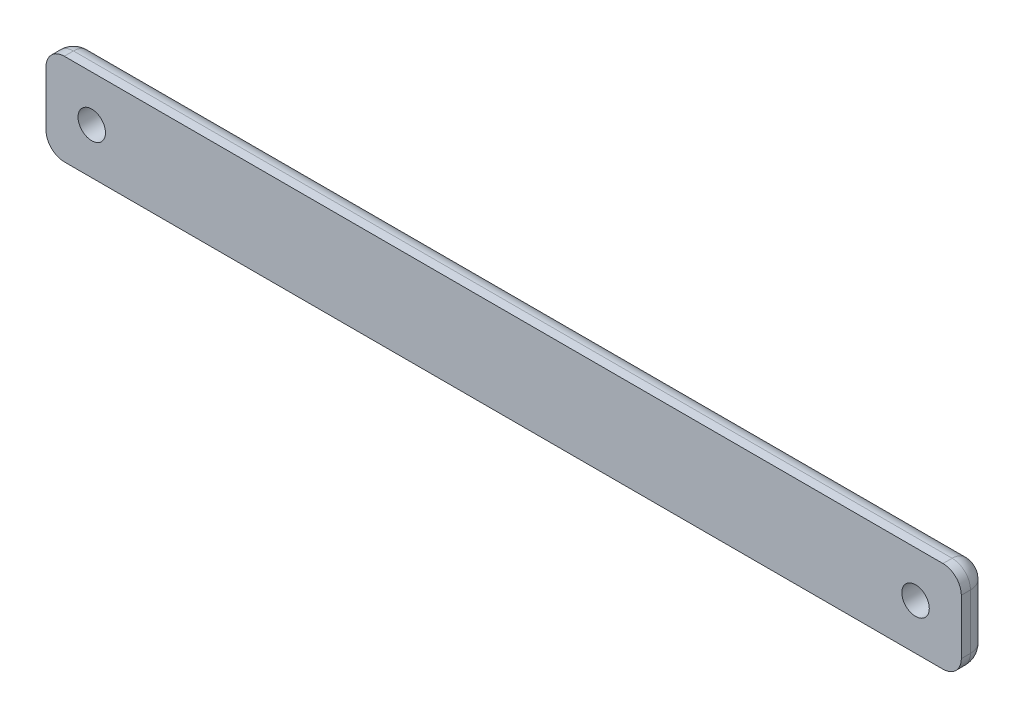
ISO-10303-21;
HEADER;
FILE_DESCRIPTION(('STEP AP214'),'2;1');
FILE_NAME('part.step','',(''),(''),'','','');
FILE_SCHEMA(('AUTOMOTIVE_DESIGN { 1 0 10303 214 1 1 1 1 }'));
ENDSEC;
DATA;
#1=APPLICATION_CONTEXT('core data for automotive mechanical design processes');
#2=APPLICATION_PROTOCOL_DEFINITION('international standard','automotive_design',2000,#1);
#3=PRODUCT_CONTEXT('',#1,'mechanical');
#4=PRODUCT('Part','Part','',(#3));
#5=PRODUCT_RELATED_PRODUCT_CATEGORY('part','',(#4));
#6=PRODUCT_DEFINITION_FORMATION('','',#4);
#7=PRODUCT_DEFINITION_CONTEXT('part definition',#1,'design');
#8=PRODUCT_DEFINITION('design','',#6,#7);
#9=PRODUCT_DEFINITION_SHAPE('','',#8);
#10=(LENGTH_UNIT() NAMED_UNIT(*) SI_UNIT(.MILLI.,.METRE.));
#11=(NAMED_UNIT(*) PLANE_ANGLE_UNIT() SI_UNIT($,.RADIAN.));
#12=(NAMED_UNIT(*) SI_UNIT($,.STERADIAN.) SOLID_ANGLE_UNIT());
#13=UNCERTAINTY_MEASURE_WITH_UNIT(LENGTH_MEASURE(1.E-05),#10,'distance_accuracy_value','');
#14=(GEOMETRIC_REPRESENTATION_CONTEXT(3) GLOBAL_UNCERTAINTY_ASSIGNED_CONTEXT((#13)) GLOBAL_UNIT_ASSIGNED_CONTEXT((#10,
#11,#12)) REPRESENTATION_CONTEXT('',''));
#15=CARTESIAN_POINT('',(0.,0.,0.));
#16=DIRECTION('',(0.,0.,1.));
#17=DIRECTION('',(1.,0.,0.));
#18=AXIS2_PLACEMENT_3D('',#15,#16,#17);
#19=CARTESIAN_POINT('',(50.,5.,1.5));
#20=DIRECTION('',(-1.,0.,0.));
#21=DIRECTION('',(0.,0.,1.));
#22=AXIS2_PLACEMENT_3D('',#19,#20,#21);
#23=PLANE('',#22);
#24=DIRECTION('',(0.,1.,0.));
#25=VECTOR('',#24,1.);
#26=CARTESIAN_POINT('',(50.,5.,1.5));
#27=LINE('',#26,#25);
#28=CARTESIAN_POINT('',(50.,-3.,1.5));
#29=VERTEX_POINT('',#28);
#30=CARTESIAN_POINT('',(50.,3.,1.5));
#31=VERTEX_POINT('',#30);
#32=EDGE_CURVE('E130',#29,#31,#27,.T.);
#33=ORIENTED_EDGE('',*,*,#32,.F.);
#34=DIRECTION('',(0.,0.,-1.));
#35=VECTOR('',#34,1.);
#36=CARTESIAN_POINT('',(50.,-3.,1.5));
#37=LINE('',#36,#35);
#38=CARTESIAN_POINT('',(50.,-3.,0.5));
#39=VERTEX_POINT('',#38);
#40=EDGE_CURVE('E143',#29,#39,#37,.T.);
#41=ORIENTED_EDGE('',*,*,#40,.T.);
#42=DIRECTION('',(0.,1.,0.));
#43=VECTOR('',#42,1.);
#44=CARTESIAN_POINT('',(50.,5.,0.5));
#45=LINE('',#44,#43);
#46=CARTESIAN_POINT('',(50.,3.,0.5));
#47=VERTEX_POINT('',#46);
#48=EDGE_CURVE('E159',#39,#47,#45,.T.);
#49=ORIENTED_EDGE('',*,*,#48,.T.);
#50=DIRECTION('',(0.,0.,-1.));
#51=VECTOR('',#50,1.);
#52=CARTESIAN_POINT('',(50.,3.,1.5));
#53=LINE('',#52,#51);
#54=EDGE_CURVE('E145',#47,#31,#53,.F.);
#55=ORIENTED_EDGE('',*,*,#54,.T.);
#56=EDGE_LOOP('',(#33,#41,#49,#55));
#57=FACE_BOUND('',#56,.T.);
#58=ADVANCED_FACE('F45',(#57),#23,.F.);
#59=CARTESIAN_POINT('',(-50.,5.,1.5));
#60=DIRECTION('',(0.,-1.,0.));
#61=DIRECTION('',(0.,0.,-1.));
#62=AXIS2_PLACEMENT_3D('',#59,#60,#61);
#63=PLANE('',#62);
#64=DIRECTION('',(-1.,0.,0.));
#65=VECTOR('',#64,1.);
#66=CARTESIAN_POINT('',(-50.,5.,0.5));
#67=LINE('',#66,#65);
#68=CARTESIAN_POINT('',(48.,5.,0.5));
#69=VERTEX_POINT('',#68);
#70=CARTESIAN_POINT('',(-48.,5.,0.5));
#71=VERTEX_POINT('',#70);
#72=EDGE_CURVE('E184',#69,#71,#67,.T.);
#73=ORIENTED_EDGE('',*,*,#72,.T.);
#74=DIRECTION('',(0.,0.,-1.));
#75=VECTOR('',#74,1.);
#76=CARTESIAN_POINT('',(-48.,5.,1.5));
#77=LINE('',#76,#75);
#78=CARTESIAN_POINT('',(-48.,5.,1.5));
#79=VERTEX_POINT('',#78);
#80=EDGE_CURVE('E190',#71,#79,#77,.F.);
#81=ORIENTED_EDGE('',*,*,#80,.T.);
#82=DIRECTION('',(-1.,0.,0.));
#83=VECTOR('',#82,1.);
#84=CARTESIAN_POINT('',(-50.,5.,1.5));
#85=LINE('',#84,#83);
#86=CARTESIAN_POINT('',(48.,5.,1.5));
#87=VERTEX_POINT('',#86);
#88=EDGE_CURVE('E147',#87,#79,#85,.T.);
#89=ORIENTED_EDGE('',*,*,#88,.F.);
#90=DIRECTION('',(0.,0.,-1.));
#91=VECTOR('',#90,1.);
#92=CARTESIAN_POINT('',(48.,5.,1.5));
#93=LINE('',#92,#91);
#94=EDGE_CURVE('E187',#87,#69,#93,.T.);
#95=ORIENTED_EDGE('',*,*,#94,.T.);
#96=EDGE_LOOP('',(#73,#81,#89,#95));
#97=FACE_BOUND('',#96,.T.);
#98=ADVANCED_FACE('F291',(#97),#63,.F.);
#99=CARTESIAN_POINT('',(-50.,5.,1.5));
#100=DIRECTION('',(1.,0.,0.));
#101=DIRECTION('',(0.,0.,-1.));
#102=AXIS2_PLACEMENT_3D('',#99,#100,#101);
#103=PLANE('',#102);
#104=DIRECTION('',(0.,-1.,0.));
#105=VECTOR('',#104,1.);
#106=CARTESIAN_POINT('',(-50.,5.,0.5));
#107=LINE('',#106,#105);
#108=CARTESIAN_POINT('',(-50.,3.,0.5));
#109=VERTEX_POINT('',#108);
#110=CARTESIAN_POINT('',(-50.,-3.,0.5));
#111=VERTEX_POINT('',#110);
#112=EDGE_CURVE('E138',#109,#111,#107,.T.);
#113=ORIENTED_EDGE('',*,*,#112,.T.);
#114=DIRECTION('',(0.,0.,-1.));
#115=VECTOR('',#114,1.);
#116=CARTESIAN_POINT('',(-50.,-3.,1.5));
#117=LINE('',#116,#115);
#118=CARTESIAN_POINT('',(-50.,-3.,1.5));
#119=VERTEX_POINT('',#118);
#120=EDGE_CURVE('E181',#111,#119,#117,.F.);
#121=ORIENTED_EDGE('',*,*,#120,.T.);
#122=DIRECTION('',(0.,-1.,0.));
#123=VECTOR('',#122,1.);
#124=CARTESIAN_POINT('',(-50.,5.,1.5));
#125=LINE('',#124,#123);
#126=CARTESIAN_POINT('',(-50.,3.,1.5));
#127=VERTEX_POINT('',#126);
#128=EDGE_CURVE('E262',#127,#119,#125,.T.);
#129=ORIENTED_EDGE('',*,*,#128,.F.);
#130=DIRECTION('',(0.,0.,-1.));
#131=VECTOR('',#130,1.);
#132=CARTESIAN_POINT('',(-50.,3.,1.5));
#133=LINE('',#132,#131);
#134=EDGE_CURVE('E178',#127,#109,#133,.T.);
#135=ORIENTED_EDGE('',*,*,#134,.T.);
#136=EDGE_LOOP('',(#113,#121,#129,#135));
#137=FACE_BOUND('',#136,.T.);
#138=ADVANCED_FACE('F299',(#137),#103,.F.);
#139=CARTESIAN_POINT('',(-50.,-5.,1.5));
#140=DIRECTION('',(0.,1.,0.));
#141=DIRECTION('',(0.,0.,1.));
#142=AXIS2_PLACEMENT_3D('',#139,#140,#141);
#143=PLANE('',#142);
#144=DIRECTION('',(1.,0.,0.));
#145=VECTOR('',#144,1.);
#146=CARTESIAN_POINT('',(-50.,-5.,0.5));
#147=LINE('',#146,#145);
#148=CARTESIAN_POINT('',(-48.,-5.,0.5));
#149=VERTEX_POINT('',#148);
#150=CARTESIAN_POINT('',(48.,-5.,0.5));
#151=VERTEX_POINT('',#150);
#152=EDGE_CURVE('E153',#149,#151,#147,.T.);
#153=ORIENTED_EDGE('',*,*,#152,.T.);
#154=DIRECTION('',(0.,0.,-1.));
#155=VECTOR('',#154,1.);
#156=CARTESIAN_POINT('',(48.,-5.,1.5));
#157=LINE('',#156,#155);
#158=CARTESIAN_POINT('',(48.,-5.,1.5));
#159=VERTEX_POINT('',#158);
#160=EDGE_CURVE('E165',#151,#159,#157,.F.);
#161=ORIENTED_EDGE('',*,*,#160,.T.);
#162=DIRECTION('',(1.,0.,0.));
#163=VECTOR('',#162,1.);
#164=CARTESIAN_POINT('',(-50.,-5.,1.5));
#165=LINE('',#164,#163);
#166=CARTESIAN_POINT('',(-48.,-5.,1.5));
#167=VERTEX_POINT('',#166);
#168=EDGE_CURVE('E133',#167,#159,#165,.T.);
#169=ORIENTED_EDGE('',*,*,#168,.F.);
#170=DIRECTION('',(0.,0.,-1.));
#171=VECTOR('',#170,1.);
#172=CARTESIAN_POINT('',(-48.,-5.,1.5));
#173=LINE('',#172,#171);
#174=EDGE_CURVE('E157',#167,#149,#173,.T.);
#175=ORIENTED_EDGE('',*,*,#174,.T.);
#176=EDGE_LOOP('',(#153,#161,#169,#175));
#177=FACE_BOUND('',#176,.T.);
#178=ADVANCED_FACE('F316',(#177),#143,.F.);
#179=CARTESIAN_POINT('',(0.,0.,1.5));
#180=DIRECTION('',(0.,0.,1.));
#181=DIRECTION('',(1.,0.,0.));
#182=AXIS2_PLACEMENT_3D('',#179,#180,#181);
#183=PLANE('',#182);
#184=CARTESIAN_POINT('',(-45.,0.,1.5));
#185=DIRECTION('',(0.,0.,1.));
#186=DIRECTION('',(1.,0.,0.));
#187=AXIS2_PLACEMENT_3D('',#184,#185,#186);
#188=CIRCLE('',#187,1.5);
#189=CARTESIAN_POINT('',(-43.5,0.,1.5));
#190=VERTEX_POINT('',#189);
#191=EDGE_CURVE('E250',#190,#190,#188,.T.);
#192=ORIENTED_EDGE('',*,*,#191,.F.);
#193=EDGE_LOOP('',(#192));
#194=FACE_BOUND('',#193,.T.);
#195=CARTESIAN_POINT('',(45.,0.,1.5));
#196=DIRECTION('',(0.,0.,1.));
#197=DIRECTION('',(1.,0.,0.));
#198=AXIS2_PLACEMENT_3D('',#195,#196,#197);
#199=CIRCLE('',#198,1.5);
#200=CARTESIAN_POINT('',(46.5,0.,1.5));
#201=VERTEX_POINT('',#200);
#202=EDGE_CURVE('E244',#201,#201,#199,.T.);
#203=ORIENTED_EDGE('',*,*,#202,.F.);
#204=EDGE_LOOP('',(#203));
#205=FACE_BOUND('',#204,.T.);
#206=ORIENTED_EDGE('',*,*,#168,.T.);
#207=CARTESIAN_POINT('',(48.,-3.,1.5));
#208=DIRECTION('',(0.,0.,1.));
#209=DIRECTION('',(1.,0.,0.));
#210=AXIS2_PLACEMENT_3D('',#207,#208,#209);
#211=CIRCLE('',#210,2.);
#212=EDGE_CURVE('E127',#159,#29,#211,.T.);
#213=ORIENTED_EDGE('',*,*,#212,.T.);
#214=ORIENTED_EDGE('',*,*,#32,.T.);
#215=CARTESIAN_POINT('',(48.,3.,1.5));
#216=DIRECTION('',(0.,0.,1.));
#217=DIRECTION('',(1.,0.,0.));
#218=AXIS2_PLACEMENT_3D('',#215,#216,#217);
#219=CIRCLE('',#218,2.);
#220=EDGE_CURVE('E168',#31,#87,#219,.T.);
#221=ORIENTED_EDGE('',*,*,#220,.T.);
#222=ORIENTED_EDGE('',*,*,#88,.T.);
#223=CARTESIAN_POINT('',(-48.,3.,1.5));
#224=DIRECTION('',(0.,0.,1.));
#225=DIRECTION('',(1.,0.,0.));
#226=AXIS2_PLACEMENT_3D('',#223,#224,#225);
#227=CIRCLE('',#226,2.);
#228=EDGE_CURVE('E171',#79,#127,#227,.T.);
#229=ORIENTED_EDGE('',*,*,#228,.T.);
#230=ORIENTED_EDGE('',*,*,#128,.T.);
#231=CARTESIAN_POINT('',(-48.,-3.,1.5));
#232=DIRECTION('',(0.,0.,1.));
#233=DIRECTION('',(1.,0.,0.));
#234=AXIS2_PLACEMENT_3D('',#231,#232,#233);
#235=CIRCLE('',#234,2.);
#236=EDGE_CURVE('E139',#119,#167,#235,.T.);
#237=ORIENTED_EDGE('',*,*,#236,.T.);
#238=EDGE_LOOP('',(#206,#213,#214,#221,#222,#229,#230,#237));
#239=FACE_BOUND('',#238,.T.);
#240=ADVANCED_FACE('F129',(#194,#205,#239),#183,.T.);
#241=CARTESIAN_POINT('',(0.,0.,-1.5));
#242=DIRECTION('',(0.,0.,1.));
#243=DIRECTION('',(1.,0.,0.));
#244=AXIS2_PLACEMENT_3D('',#241,#242,#243);
#245=PLANE('',#244);
#246=DIRECTION('',(-1.,0.,0.));
#247=VECTOR('',#246,1.);
#248=CARTESIAN_POINT('',(0.,3.,-1.5));
#249=LINE('',#248,#247);
#250=CARTESIAN_POINT('',(-48.,3.,-1.5));
#251=VERTEX_POINT('',#250);
#252=CARTESIAN_POINT('',(48.,3.,-1.5));
#253=VERTEX_POINT('',#252);
#254=EDGE_CURVE('E193',#251,#253,#249,.F.);
#255=ORIENTED_EDGE('',*,*,#254,.T.);
#256=DIRECTION('',(0.,1.,0.));
#257=VECTOR('',#256,1.);
#258=CARTESIAN_POINT('',(48.,0.,-1.5));
#259=LINE('',#258,#257);
#260=CARTESIAN_POINT('',(48.,-3.,-1.5));
#261=VERTEX_POINT('',#260);
#262=EDGE_CURVE('E11',#253,#261,#259,.F.);
#263=ORIENTED_EDGE('',*,*,#262,.T.);
#264=DIRECTION('',(1.,0.,0.));
#265=VECTOR('',#264,1.);
#266=CARTESIAN_POINT('',(0.,-3.,-1.5));
#267=LINE('',#266,#265);
#268=CARTESIAN_POINT('',(-48.,-3.,-1.5));
#269=VERTEX_POINT('',#268);
#270=EDGE_CURVE('E55',#261,#269,#267,.F.);
#271=ORIENTED_EDGE('',*,*,#270,.T.);
#272=DIRECTION('',(0.,-1.,0.));
#273=VECTOR('',#272,1.);
#274=CARTESIAN_POINT('',(-48.,0.,-1.5));
#275=LINE('',#274,#273);
#276=EDGE_CURVE('E196',#269,#251,#275,.F.);
#277=ORIENTED_EDGE('',*,*,#276,.T.);
#278=EDGE_LOOP('',(#255,#263,#271,#277));
#279=FACE_BOUND('',#278,.T.);
#280=CARTESIAN_POINT('',(-45.,0.,-1.5));
#281=DIRECTION('',(0.,0.,1.));
#282=DIRECTION('',(1.,0.,0.));
#283=AXIS2_PLACEMENT_3D('',#280,#281,#282);
#284=CIRCLE('',#283,1.5);
#285=CARTESIAN_POINT('',(-43.5,0.,-1.5));
#286=VERTEX_POINT('',#285);
#287=EDGE_CURVE('E148',#286,#286,#284,.T.);
#288=ORIENTED_EDGE('',*,*,#287,.T.);
#289=EDGE_LOOP('',(#288));
#290=FACE_BOUND('',#289,.T.);
#291=CARTESIAN_POINT('',(45.,0.,-1.5));
#292=DIRECTION('',(0.,0.,1.));
#293=DIRECTION('',(1.,0.,0.));
#294=AXIS2_PLACEMENT_3D('',#291,#292,#293);
#295=CIRCLE('',#294,1.5);
#296=CARTESIAN_POINT('',(46.5,0.,-1.5));
#297=VERTEX_POINT('',#296);
#298=EDGE_CURVE('E256',#297,#297,#295,.T.);
#299=ORIENTED_EDGE('',*,*,#298,.T.);
#300=EDGE_LOOP('',(#299));
#301=FACE_BOUND('',#300,.T.);
#302=ADVANCED_FACE('F286',(#279,#290,#301),#245,.F.);
#303=CARTESIAN_POINT('',(45.,0.,-8.5));
#304=DIRECTION('',(0.,0.,1.));
#305=DIRECTION('',(1.,0.,0.));
#306=AXIS2_PLACEMENT_3D('',#303,#304,#305);
#307=CYLINDRICAL_SURFACE('',#306,1.5);
#308=ORIENTED_EDGE('',*,*,#202,.T.);
#309=EDGE_LOOP('',(#308));
#310=FACE_BOUND('',#309,.T.);
#311=ORIENTED_EDGE('',*,*,#298,.F.);
#312=EDGE_LOOP('',(#311));
#313=FACE_BOUND('',#312,.T.);
#314=ADVANCED_FACE('F340',(#310,#313),#307,.F.);
#315=CARTESIAN_POINT('',(-45.,0.,-8.5));
#316=DIRECTION('',(0.,0.,1.));
#317=DIRECTION('',(1.,0.,0.));
#318=AXIS2_PLACEMENT_3D('',#315,#316,#317);
#319=CYLINDRICAL_SURFACE('',#318,1.5);
#320=ORIENTED_EDGE('',*,*,#191,.T.);
#321=EDGE_LOOP('',(#320));
#322=FACE_BOUND('',#321,.T.);
#323=ORIENTED_EDGE('',*,*,#287,.F.);
#324=EDGE_LOOP('',(#323));
#325=FACE_BOUND('',#324,.T.);
#326=ADVANCED_FACE('F346',(#322,#325),#319,.F.);
#327=CARTESIAN_POINT('',(-48.,3.,1.5));
#328=DIRECTION('',(0.,0.,-1.));
#329=DIRECTION('',(-1.,0.,0.));
#330=AXIS2_PLACEMENT_3D('',#327,#328,#329);
#331=CYLINDRICAL_SURFACE('',#330,2.);
#332=CARTESIAN_POINT('',(-48.,3.,0.5));
#333=DIRECTION('',(0.,0.,-1.));
#334=DIRECTION('',(-1.,0.,0.));
#335=AXIS2_PLACEMENT_3D('',#332,#333,#334);
#336=CIRCLE('',#335,2.);
#337=EDGE_CURVE('E49',#109,#71,#336,.T.);
#338=ORIENTED_EDGE('',*,*,#337,.F.);
#339=ORIENTED_EDGE('',*,*,#134,.F.);
#340=ORIENTED_EDGE('',*,*,#228,.F.);
#341=ORIENTED_EDGE('',*,*,#80,.F.);
#342=EDGE_LOOP('',(#338,#339,#340,#341));
#343=FACE_BOUND('',#342,.T.);
#344=ADVANCED_FACE('F47',(#343),#331,.T.);
#345=CARTESIAN_POINT('',(-48.,3.,0.5));
#346=DIRECTION('',(0.,1.,0.));
#347=DIRECTION('',(0.,0.,1.));
#348=AXIS2_PLACEMENT_3D('',#345,#346,#347);
#349=SPHERICAL_SURFACE('',#348,2.);
#350=CARTESIAN_POINT('',(-48.,3.,0.5));
#351=DIRECTION('',(0.,1.,0.));
#352=DIRECTION('',(0.,0.,1.));
#353=AXIS2_PLACEMENT_3D('',#350,#351,#352);
#354=CIRCLE('',#353,2.);
#355=EDGE_CURVE('E232',#109,#251,#354,.F.);
#356=ORIENTED_EDGE('',*,*,#355,.F.);
#357=ORIENTED_EDGE('',*,*,#337,.T.);
#358=CARTESIAN_POINT('',(-48.,3.,0.5));
#359=DIRECTION('',(-1.,0.,0.));
#360=DIRECTION('',(0.,0.,1.));
#361=AXIS2_PLACEMENT_3D('',#358,#359,#360);
#362=CIRCLE('',#361,2.);
#363=EDGE_CURVE('E235',#251,#71,#362,.F.);
#364=ORIENTED_EDGE('',*,*,#363,.F.);
#365=EDGE_LOOP('',(#356,#357,#364));
#366=FACE_BOUND('',#365,.T.);
#367=ADVANCED_FACE('F351',(#366),#349,.T.);
#368=CARTESIAN_POINT('',(48.,3.,1.5));
#369=DIRECTION('',(0.,0.,-1.));
#370=DIRECTION('',(-1.,0.,0.));
#371=AXIS2_PLACEMENT_3D('',#368,#369,#370);
#372=CYLINDRICAL_SURFACE('',#371,2.);
#373=ORIENTED_EDGE('',*,*,#220,.F.);
#374=ORIENTED_EDGE('',*,*,#54,.F.);
#375=CARTESIAN_POINT('',(48.,3.,0.5));
#376=DIRECTION('',(0.,0.,-1.));
#377=DIRECTION('',(-1.,0.,0.));
#378=AXIS2_PLACEMENT_3D('',#375,#376,#377);
#379=CIRCLE('',#378,2.);
#380=EDGE_CURVE('E228',#69,#47,#379,.T.);
#381=ORIENTED_EDGE('',*,*,#380,.F.);
#382=ORIENTED_EDGE('',*,*,#94,.F.);
#383=EDGE_LOOP('',(#373,#374,#381,#382));
#384=FACE_BOUND('',#383,.T.);
#385=ADVANCED_FACE('F278',(#384),#372,.T.);
#386=CARTESIAN_POINT('',(-50.,3.,0.5));
#387=DIRECTION('',(-1.,0.,0.));
#388=DIRECTION('',(0.,0.,1.));
#389=AXIS2_PLACEMENT_3D('',#386,#387,#388);
#390=CYLINDRICAL_SURFACE('',#389,2.);
#391=ORIENTED_EDGE('',*,*,#363,.T.);
#392=ORIENTED_EDGE('',*,*,#72,.F.);
#393=CARTESIAN_POINT('',(48.,3.,0.5));
#394=DIRECTION('',(1.,0.,0.));
#395=DIRECTION('',(0.,0.,-1.));
#396=AXIS2_PLACEMENT_3D('',#393,#394,#395);
#397=CIRCLE('',#396,2.);
#398=EDGE_CURVE('E224',#253,#69,#397,.T.);
#399=ORIENTED_EDGE('',*,*,#398,.F.);
#400=ORIENTED_EDGE('',*,*,#254,.F.);
#401=EDGE_LOOP('',(#391,#392,#399,#400));
#402=FACE_BOUND('',#401,.T.);
#403=ADVANCED_FACE('F288',(#402),#390,.T.);
#404=CARTESIAN_POINT('',(-48.,5.,0.5));
#405=DIRECTION('',(0.,-1.,0.));
#406=DIRECTION('',(0.,0.,-1.));
#407=AXIS2_PLACEMENT_3D('',#404,#405,#406);
#408=CYLINDRICAL_SURFACE('',#407,2.);
#409=ORIENTED_EDGE('',*,*,#355,.T.);
#410=ORIENTED_EDGE('',*,*,#276,.F.);
#411=CARTESIAN_POINT('',(-48.,-3.,0.5));
#412=DIRECTION('',(0.,-1.,0.));
#413=DIRECTION('',(0.,0.,-1.));
#414=AXIS2_PLACEMENT_3D('',#411,#412,#413);
#415=CIRCLE('',#414,2.);
#416=EDGE_CURVE('E220',#111,#269,#415,.T.);
#417=ORIENTED_EDGE('',*,*,#416,.F.);
#418=ORIENTED_EDGE('',*,*,#112,.F.);
#419=EDGE_LOOP('',(#409,#410,#417,#418));
#420=FACE_BOUND('',#419,.T.);
#421=ADVANCED_FACE('F309',(#420),#408,.T.);
#422=CARTESIAN_POINT('',(-48.,-3.,1.5));
#423=DIRECTION('',(0.,0.,-1.));
#424=DIRECTION('',(-1.,0.,0.));
#425=AXIS2_PLACEMENT_3D('',#422,#423,#424);
#426=CYLINDRICAL_SURFACE('',#425,2.);
#427=ORIENTED_EDGE('',*,*,#236,.F.);
#428=ORIENTED_EDGE('',*,*,#120,.F.);
#429=CARTESIAN_POINT('',(-48.,-3.,0.5));
#430=DIRECTION('',(0.,0.,-1.));
#431=DIRECTION('',(-1.,0.,0.));
#432=AXIS2_PLACEMENT_3D('',#429,#430,#431);
#433=CIRCLE('',#432,2.);
#434=EDGE_CURVE('E216',#149,#111,#433,.T.);
#435=ORIENTED_EDGE('',*,*,#434,.F.);
#436=ORIENTED_EDGE('',*,*,#174,.F.);
#437=EDGE_LOOP('',(#427,#428,#435,#436));
#438=FACE_BOUND('',#437,.T.);
#439=ADVANCED_FACE('F305',(#438),#426,.T.);
#440=CARTESIAN_POINT('',(48.,3.,0.5));
#441=DIRECTION('',(0.,1.,0.));
#442=DIRECTION('',(0.,0.,1.));
#443=AXIS2_PLACEMENT_3D('',#440,#441,#442);
#444=SPHERICAL_SURFACE('',#443,2.);
#445=ORIENTED_EDGE('',*,*,#398,.T.);
#446=ORIENTED_EDGE('',*,*,#380,.T.);
#447=CARTESIAN_POINT('',(48.,3.,0.5));
#448=DIRECTION('',(0.,1.,0.));
#449=DIRECTION('',(0.,0.,1.));
#450=AXIS2_PLACEMENT_3D('',#447,#448,#449);
#451=CIRCLE('',#450,2.);
#452=EDGE_CURVE('E212',#253,#47,#451,.F.);
#453=ORIENTED_EDGE('',*,*,#452,.F.);
#454=EDGE_LOOP('',(#445,#446,#453));
#455=FACE_BOUND('',#454,.T.);
#456=ADVANCED_FACE('F282',(#455),#444,.T.);
#457=CARTESIAN_POINT('',(-48.,-3.,0.5));
#458=DIRECTION('',(-1.,0.,0.));
#459=DIRECTION('',(0.,0.,1.));
#460=AXIS2_PLACEMENT_3D('',#457,#458,#459);
#461=SPHERICAL_SURFACE('',#460,2.);
#462=ORIENTED_EDGE('',*,*,#434,.T.);
#463=ORIENTED_EDGE('',*,*,#416,.T.);
#464=CARTESIAN_POINT('',(-48.,-3.,0.5));
#465=DIRECTION('',(-1.,0.,0.));
#466=DIRECTION('',(0.,0.,1.));
#467=AXIS2_PLACEMENT_3D('',#464,#465,#466);
#468=CIRCLE('',#467,2.);
#469=EDGE_CURVE('E208',#149,#269,#468,.F.);
#470=ORIENTED_EDGE('',*,*,#469,.F.);
#471=EDGE_LOOP('',(#462,#463,#470));
#472=FACE_BOUND('',#471,.T.);
#473=ADVANCED_FACE('F311',(#472),#461,.T.);
#474=CARTESIAN_POINT('',(48.,5.,0.5));
#475=DIRECTION('',(0.,1.,0.));
#476=DIRECTION('',(0.,0.,1.));
#477=AXIS2_PLACEMENT_3D('',#474,#475,#476);
#478=CYLINDRICAL_SURFACE('',#477,2.);
#479=ORIENTED_EDGE('',*,*,#452,.T.);
#480=ORIENTED_EDGE('',*,*,#48,.F.);
#481=CARTESIAN_POINT('',(48.,-3.,0.5));
#482=DIRECTION('',(0.,-1.,0.));
#483=DIRECTION('',(0.,0.,-1.));
#484=AXIS2_PLACEMENT_3D('',#481,#482,#483);
#485=CIRCLE('',#484,2.);
#486=EDGE_CURVE('E205',#261,#39,#485,.T.);
#487=ORIENTED_EDGE('',*,*,#486,.F.);
#488=ORIENTED_EDGE('',*,*,#262,.F.);
#489=EDGE_LOOP('',(#479,#480,#487,#488));
#490=FACE_BOUND('',#489,.T.);
#491=ADVANCED_FACE('F285',(#490),#478,.T.);
#492=CARTESIAN_POINT('',(-50.,-3.,0.5));
#493=DIRECTION('',(1.,0.,0.));
#494=DIRECTION('',(0.,0.,-1.));
#495=AXIS2_PLACEMENT_3D('',#492,#493,#494);
#496=CYLINDRICAL_SURFACE('',#495,2.);
#497=ORIENTED_EDGE('',*,*,#469,.T.);
#498=ORIENTED_EDGE('',*,*,#270,.F.);
#499=CARTESIAN_POINT('',(48.,-3.,0.5));
#500=DIRECTION('',(1.,0.,0.));
#501=DIRECTION('',(0.,0.,-1.));
#502=AXIS2_PLACEMENT_3D('',#499,#500,#501);
#503=CIRCLE('',#502,2.);
#504=EDGE_CURVE('E63',#151,#261,#503,.T.);
#505=ORIENTED_EDGE('',*,*,#504,.F.);
#506=ORIENTED_EDGE('',*,*,#152,.F.);
#507=EDGE_LOOP('',(#497,#498,#505,#506));
#508=FACE_BOUND('',#507,.T.);
#509=ADVANCED_FACE('F314',(#508),#496,.T.);
#510=CARTESIAN_POINT('',(48.,-3.,0.5));
#511=DIRECTION('',(0.,0.,-1.));
#512=DIRECTION('',(-1.,0.,0.));
#513=AXIS2_PLACEMENT_3D('',#510,#511,#512);
#514=SPHERICAL_SURFACE('',#513,2.);
#515=ORIENTED_EDGE('',*,*,#504,.T.);
#516=ORIENTED_EDGE('',*,*,#486,.T.);
#517=CARTESIAN_POINT('',(48.,-3.,0.5));
#518=DIRECTION('',(0.,0.,-1.));
#519=DIRECTION('',(-1.,0.,0.));
#520=AXIS2_PLACEMENT_3D('',#517,#518,#519);
#521=CIRCLE('',#520,2.);
#522=EDGE_CURVE('E151',#151,#39,#521,.F.);
#523=ORIENTED_EDGE('',*,*,#522,.F.);
#524=EDGE_LOOP('',(#515,#516,#523));
#525=FACE_BOUND('',#524,.T.);
#526=ADVANCED_FACE('F317',(#525),#514,.T.);
#527=CARTESIAN_POINT('',(48.,-3.,1.5));
#528=DIRECTION('',(0.,0.,-1.));
#529=DIRECTION('',(-1.,0.,0.));
#530=AXIS2_PLACEMENT_3D('',#527,#528,#529);
#531=CYLINDRICAL_SURFACE('',#530,2.);
#532=ORIENTED_EDGE('',*,*,#212,.F.);
#533=ORIENTED_EDGE('',*,*,#160,.F.);
#534=ORIENTED_EDGE('',*,*,#522,.T.);
#535=ORIENTED_EDGE('',*,*,#40,.F.);
#536=EDGE_LOOP('',(#532,#533,#534,#535));
#537=FACE_BOUND('',#536,.T.);
#538=ADVANCED_FACE('F150',(#537),#531,.T.);
#539=CLOSED_SHELL('',(#58,#98,#138,#178,#240,#302,#314,#326,#344,#367,#385,#403,#421,#439,#456,
#473,#491,#509,#526,#538));
#540=MANIFOLD_SOLID_BREP('B2',#539);
#541=ADVANCED_BREP_SHAPE_REPRESENTATION('',(#18,#540),#14);
#542=SHAPE_DEFINITION_REPRESENTATION(#9,#541);
ENDSEC;
END-ISO-10303-21;
